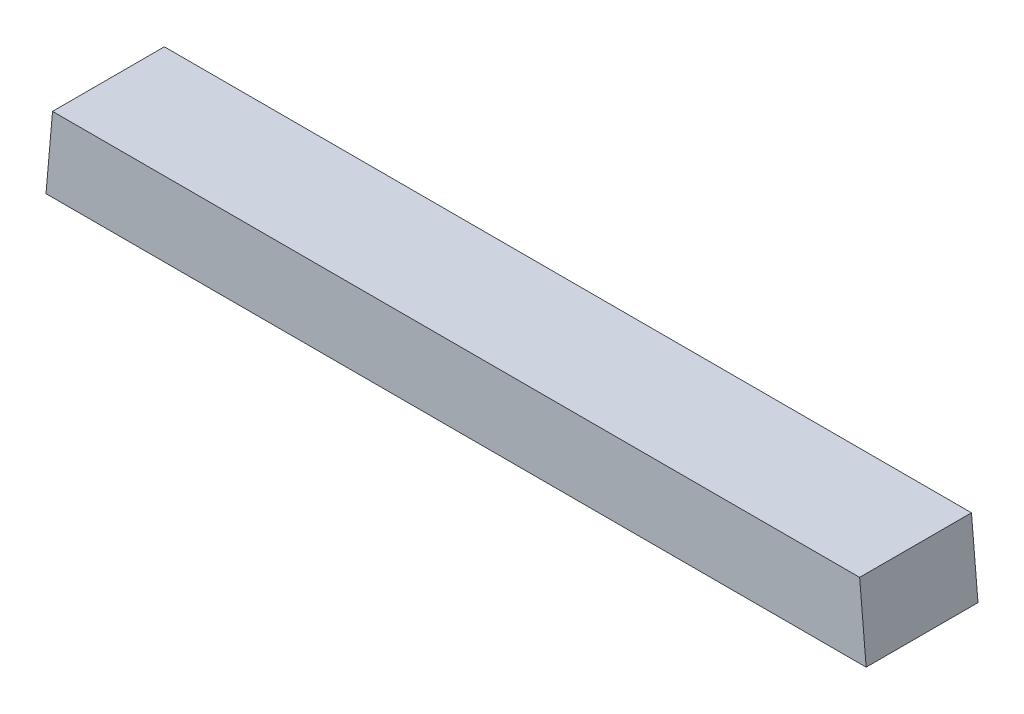
ISO-10303-21;
HEADER;
FILE_DESCRIPTION(('STEP AP214'),'2;1');
FILE_NAME('part.step','',(''),(''),'','','');
FILE_SCHEMA(('AUTOMOTIVE_DESIGN { 1 0 10303 214 1 1 1 1 }'));
ENDSEC;
DATA;
#1=APPLICATION_CONTEXT('core data for automotive mechanical design processes');
#2=APPLICATION_PROTOCOL_DEFINITION('international standard','automotive_design',2000,#1);
#3=PRODUCT_CONTEXT('',#1,'mechanical');
#4=PRODUCT('Part','Part','',(#3));
#5=PRODUCT_RELATED_PRODUCT_CATEGORY('part','',(#4));
#6=PRODUCT_DEFINITION_FORMATION('','',#4);
#7=PRODUCT_DEFINITION_CONTEXT('part definition',#1,'design');
#8=PRODUCT_DEFINITION('design','',#6,#7);
#9=PRODUCT_DEFINITION_SHAPE('','',#8);
#10=(LENGTH_UNIT() NAMED_UNIT(*) SI_UNIT(.MILLI.,.METRE.));
#11=(NAMED_UNIT(*) PLANE_ANGLE_UNIT() SI_UNIT($,.RADIAN.));
#12=(NAMED_UNIT(*) SI_UNIT($,.STERADIAN.) SOLID_ANGLE_UNIT());
#13=UNCERTAINTY_MEASURE_WITH_UNIT(LENGTH_MEASURE(1.E-05),#10,'distance_accuracy_value','');
#14=(GEOMETRIC_REPRESENTATION_CONTEXT(3) GLOBAL_UNCERTAINTY_ASSIGNED_CONTEXT((#13)) GLOBAL_UNIT_ASSIGNED_CONTEXT((#10,
#11,#12)) REPRESENTATION_CONTEXT('',''));
#15=CARTESIAN_POINT('',(0.,0.,0.));
#16=DIRECTION('',(0.,0.,1.));
#17=DIRECTION('',(1.,0.,0.));
#18=AXIS2_PLACEMENT_3D('',#15,#16,#17);
#19=CARTESIAN_POINT('',(0.,0.,30.));
#20=DIRECTION('',(0.,1.,0.));
#21=DIRECTION('',(0.,0.,1.));
#22=AXIS2_PLACEMENT_3D('',#19,#20,#21);
#23=PLANE('',#22);
#24=DIRECTION('',(1.,0.,0.));
#25=VECTOR('',#24,1.);
#26=CARTESIAN_POINT('',(0.,0.,0.));
#27=LINE('',#26,#25);
#28=CARTESIAN_POINT('',(0.,0.,0.));
#29=VERTEX_POINT('',#28);
#30=CARTESIAN_POINT('',(220.,0.,0.));
#31=VERTEX_POINT('',#30);
#32=EDGE_CURVE('E79',#29,#31,#27,.T.);
#33=ORIENTED_EDGE('',*,*,#32,.T.);
#34=DIRECTION('',(0.,0.,-1.));
#35=VECTOR('',#34,1.);
#36=CARTESIAN_POINT('',(220.,0.,30.));
#37=LINE('',#36,#35);
#38=CARTESIAN_POINT('',(220.,0.,30.));
#39=VERTEX_POINT('',#38);
#40=EDGE_CURVE('E40',#39,#31,#37,.T.);
#41=ORIENTED_EDGE('',*,*,#40,.F.);
#42=DIRECTION('',(1.,0.,0.));
#43=VECTOR('',#42,1.);
#44=CARTESIAN_POINT('',(0.,0.,30.));
#45=LINE('',#44,#43);
#46=CARTESIAN_POINT('',(0.,0.,30.));
#47=VERTEX_POINT('',#46);
#48=EDGE_CURVE('E88',#47,#39,#45,.T.);
#49=ORIENTED_EDGE('',*,*,#48,.F.);
#50=DIRECTION('',(0.,0.,-1.));
#51=VECTOR('',#50,1.);
#52=CARTESIAN_POINT('',(0.,0.,30.));
#53=LINE('',#52,#51);
#54=EDGE_CURVE('E11',#47,#29,#53,.T.);
#55=ORIENTED_EDGE('',*,*,#54,.T.);
#56=EDGE_LOOP('',(#33,#41,#49,#55));
#57=FACE_BOUND('',#56,.T.);
#58=ADVANCED_FACE('F32',(#57),#23,.F.);
#59=CARTESIAN_POINT('',(0.,20.,30.));
#60=DIRECTION('',(0.,-1.,0.));
#61=DIRECTION('',(0.,0.,-1.));
#62=AXIS2_PLACEMENT_3D('',#59,#60,#61);
#63=PLANE('',#62);
#64=DIRECTION('',(-1.,0.,0.));
#65=VECTOR('',#64,1.);
#66=CARTESIAN_POINT('',(0.,20.,0.));
#67=LINE('',#66,#65);
#68=CARTESIAN_POINT('',(218.250226729482,20.,0.));
#69=VERTEX_POINT('',#68);
#70=CARTESIAN_POINT('',(1.74977327051834,20.,0.));
#71=VERTEX_POINT('',#70);
#72=EDGE_CURVE('E83',#69,#71,#67,.T.);
#73=ORIENTED_EDGE('',*,*,#72,.T.);
#74=DIRECTION('',(0.,0.,1.));
#75=VECTOR('',#74,1.);
#76=CARTESIAN_POINT('',(1.74977327051834,20.,0.));
#77=LINE('',#76,#75);
#78=CARTESIAN_POINT('',(1.74977327051834,20.,30.));
#79=VERTEX_POINT('',#78);
#80=EDGE_CURVE('E47',#71,#79,#77,.T.);
#81=ORIENTED_EDGE('',*,*,#80,.T.);
#82=DIRECTION('',(-1.,0.,0.));
#83=VECTOR('',#82,1.);
#84=CARTESIAN_POINT('',(0.,20.,30.));
#85=LINE('',#84,#83);
#86=CARTESIAN_POINT('',(218.250226729482,20.,30.));
#87=VERTEX_POINT('',#86);
#88=EDGE_CURVE('E91',#87,#79,#85,.T.);
#89=ORIENTED_EDGE('',*,*,#88,.F.);
#90=DIRECTION('',(0.,0.,1.));
#91=VECTOR('',#90,1.);
#92=CARTESIAN_POINT('',(218.250226729482,20.,0.));
#93=LINE('',#92,#91);
#94=EDGE_CURVE('E76',#69,#87,#93,.T.);
#95=ORIENTED_EDGE('',*,*,#94,.F.);
#96=EDGE_LOOP('',(#73,#81,#89,#95));
#97=FACE_BOUND('',#96,.T.);
#98=ADVANCED_FACE('F113',(#97),#63,.F.);
#99=CARTESIAN_POINT('',(0.,0.,30.));
#100=DIRECTION('',(0.,0.,-1.));
#101=DIRECTION('',(-1.,0.,0.));
#102=AXIS2_PLACEMENT_3D('',#99,#100,#101);
#103=PLANE('',#102);
#104=ORIENTED_EDGE('',*,*,#88,.T.);
#105=DIRECTION('',(-0.0871557427476513,-0.996194698091746,0.));
#106=VECTOR('',#105,1.);
#107=CARTESIAN_POINT('',(0.,0.,30.));
#108=LINE('',#107,#106);
#109=EDGE_CURVE('E84',#79,#47,#108,.T.);
#110=ORIENTED_EDGE('',*,*,#109,.T.);
#111=ORIENTED_EDGE('',*,*,#48,.T.);
#112=DIRECTION('',(-0.0871557427476499,0.996194698091746,0.));
#113=VECTOR('',#112,1.);
#114=CARTESIAN_POINT('',(218.328852831343,19.1012995433605,30.));
#115=LINE('',#114,#113);
#116=EDGE_CURVE('E105',#39,#87,#115,.T.);
#117=ORIENTED_EDGE('',*,*,#116,.T.);
#118=EDGE_LOOP('',(#104,#110,#111,#117));
#119=FACE_BOUND('',#118,.T.);
#120=ADVANCED_FACE('F115',(#119),#103,.F.);
#121=CARTESIAN_POINT('',(0.,0.,0.));
#122=DIRECTION('',(0.,0.,-1.));
#123=DIRECTION('',(-1.,0.,0.));
#124=AXIS2_PLACEMENT_3D('',#121,#122,#123);
#125=PLANE('',#124);
#126=DIRECTION('',(0.0871557427476513,0.996194698091746,0.));
#127=VECTOR('',#126,1.);
#128=CARTESIAN_POINT('',(0.,0.,0.));
#129=LINE('',#128,#127);
#130=EDGE_CURVE('E69',#29,#71,#129,.T.);
#131=ORIENTED_EDGE('',*,*,#130,.T.);
#132=ORIENTED_EDGE('',*,*,#72,.F.);
#133=DIRECTION('',(0.0871557427476499,-0.996194698091746,0.));
#134=VECTOR('',#133,1.);
#135=CARTESIAN_POINT('',(220.,0.,0.));
#136=LINE('',#135,#134);
#137=EDGE_CURVE('E81',#69,#31,#136,.T.);
#138=ORIENTED_EDGE('',*,*,#137,.T.);
#139=ORIENTED_EDGE('',*,*,#32,.F.);
#140=EDGE_LOOP('',(#131,#132,#138,#139));
#141=FACE_BOUND('',#140,.T.);
#142=ADVANCED_FACE('F80',(#141),#125,.T.);
#143=CARTESIAN_POINT('',(220.,0.,0.));
#144=DIRECTION('',(-0.996194698091746,-0.0871557427476499,0.));
#145=DIRECTION('',(0.0871557427476499,-0.996194698091746,0.));
#146=AXIS2_PLACEMENT_3D('',#143,#144,#145);
#147=PLANE('',#146);
#148=ORIENTED_EDGE('',*,*,#40,.T.);
#149=ORIENTED_EDGE('',*,*,#137,.F.);
#150=ORIENTED_EDGE('',*,*,#94,.T.);
#151=ORIENTED_EDGE('',*,*,#116,.F.);
#152=EDGE_LOOP('',(#148,#149,#150,#151));
#153=FACE_BOUND('',#152,.T.);
#154=ADVANCED_FACE('F116',(#153),#147,.F.);
#155=CARTESIAN_POINT('',(0.,0.,0.));
#156=DIRECTION('',(0.996194698091746,-0.0871557427476512,0.));
#157=DIRECTION('',(0.0871557427476513,0.996194698091746,0.));
#158=AXIS2_PLACEMENT_3D('',#155,#156,#157);
#159=PLANE('',#158);
#160=ORIENTED_EDGE('',*,*,#80,.F.);
#161=ORIENTED_EDGE('',*,*,#130,.F.);
#162=ORIENTED_EDGE('',*,*,#54,.F.);
#163=ORIENTED_EDGE('',*,*,#109,.F.);
#164=EDGE_LOOP('',(#160,#161,#162,#163));
#165=FACE_BOUND('',#164,.T.);
#166=ADVANCED_FACE('F71',(#165),#159,.F.);
#167=CLOSED_SHELL('',(#58,#98,#120,#142,#154,#166));
#168=MANIFOLD_SOLID_BREP('B2',#167);
#169=ADVANCED_BREP_SHAPE_REPRESENTATION('',(#18,#168),#14);
#170=SHAPE_DEFINITION_REPRESENTATION(#9,#169);
ENDSEC;
END-ISO-10303-21;
